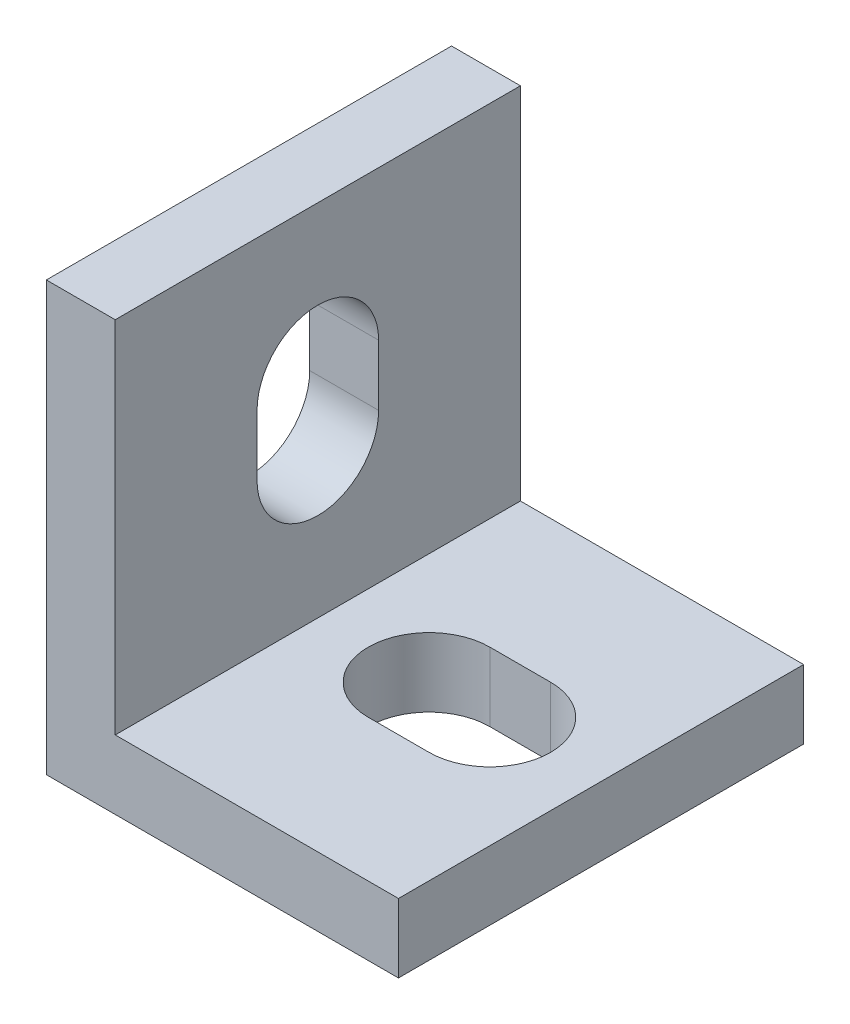
ISO-10303-21;
HEADER;
FILE_DESCRIPTION(('STEP AP214'),'2;1');
FILE_NAME('part.step','',(''),(''),'','','');
FILE_SCHEMA(('AUTOMOTIVE_DESIGN { 1 0 10303 214 1 1 1 1 }'));
ENDSEC;
DATA;
#1=APPLICATION_CONTEXT('core data for automotive mechanical design processes');
#2=APPLICATION_PROTOCOL_DEFINITION('international standard','automotive_design',2000,#1);
#3=PRODUCT_CONTEXT('',#1,'mechanical');
#4=PRODUCT('Part','Part','',(#3));
#5=PRODUCT_RELATED_PRODUCT_CATEGORY('part','',(#4));
#6=PRODUCT_DEFINITION_FORMATION('','',#4);
#7=PRODUCT_DEFINITION_CONTEXT('part definition',#1,'design');
#8=PRODUCT_DEFINITION('design','',#6,#7);
#9=PRODUCT_DEFINITION_SHAPE('','',#8);
#10=(LENGTH_UNIT() NAMED_UNIT(*) SI_UNIT(.MILLI.,.METRE.));
#11=(NAMED_UNIT(*) PLANE_ANGLE_UNIT() SI_UNIT($,.RADIAN.));
#12=(NAMED_UNIT(*) SI_UNIT($,.STERADIAN.) SOLID_ANGLE_UNIT());
#13=UNCERTAINTY_MEASURE_WITH_UNIT(LENGTH_MEASURE(1.E-05),#10,'distance_accuracy_value','');
#14=(GEOMETRIC_REPRESENTATION_CONTEXT(3) GLOBAL_UNCERTAINTY_ASSIGNED_CONTEXT((#13)) GLOBAL_UNIT_ASSIGNED_CONTEXT((#10,
#11,#12)) REPRESENTATION_CONTEXT('',''));
#15=CARTESIAN_POINT('',(0.,0.,0.));
#16=DIRECTION('',(0.,0.,1.));
#17=DIRECTION('',(1.,0.,0.));
#18=AXIS2_PLACEMENT_3D('',#15,#16,#17);
#19=CARTESIAN_POINT('',(0.,0.,20.));
#20=DIRECTION('',(1.,0.,0.));
#21=DIRECTION('',(0.,0.,-1.));
#22=AXIS2_PLACEMENT_3D('',#19,#20,#21);
#23=PLANE('',#22);
#24=DIRECTION('',(0.,1.,0.));
#25=VECTOR('',#24,1.);
#26=CARTESIAN_POINT('',(0.,0.,7.));
#27=LINE('',#26,#25);
#28=CARTESIAN_POINT('',(0.,10.775,7.));
#29=VERTEX_POINT('',#28);
#30=CARTESIAN_POINT('',(0.,13.775,7.));
#31=VERTEX_POINT('',#30);
#32=EDGE_CURVE('E231',#29,#31,#27,.T.);
#33=ORIENTED_EDGE('',*,*,#32,.T.);
#34=CARTESIAN_POINT('',(0.,13.775,10.));
#35=DIRECTION('',(1.,0.,0.));
#36=DIRECTION('',(0.,0.,-1.));
#37=AXIS2_PLACEMENT_3D('',#34,#35,#36);
#38=CIRCLE('',#37,3.);
#39=CARTESIAN_POINT('',(0.,13.775,13.));
#40=VERTEX_POINT('',#39);
#41=EDGE_CURVE('E235',#31,#40,#38,.T.);
#42=ORIENTED_EDGE('',*,*,#41,.T.);
#43=DIRECTION('',(0.,-1.,0.));
#44=VECTOR('',#43,1.);
#45=CARTESIAN_POINT('',(0.,0.,13.));
#46=LINE('',#45,#44);
#47=CARTESIAN_POINT('',(0.,10.775,13.));
#48=VERTEX_POINT('',#47);
#49=EDGE_CURVE('E214',#40,#48,#46,.T.);
#50=ORIENTED_EDGE('',*,*,#49,.T.);
#51=CARTESIAN_POINT('',(0.,10.775,10.));
#52=DIRECTION('',(1.,0.,0.));
#53=DIRECTION('',(0.,0.,-1.));
#54=AXIS2_PLACEMENT_3D('',#51,#52,#53);
#55=CIRCLE('',#54,3.);
#56=EDGE_CURVE('E227',#48,#29,#55,.T.);
#57=ORIENTED_EDGE('',*,*,#56,.T.);
#58=EDGE_LOOP('',(#33,#42,#50,#57));
#59=FACE_BOUND('',#58,.T.);
#60=DIRECTION('',(0.,-1.,0.));
#61=VECTOR('',#60,1.);
#62=CARTESIAN_POINT('',(0.,0.,0.));
#63=LINE('',#62,#61);
#64=CARTESIAN_POINT('',(0.,21.15,0.));
#65=VERTEX_POINT('',#64);
#66=CARTESIAN_POINT('',(0.,0.,0.));
#67=VERTEX_POINT('',#66);
#68=EDGE_CURVE('E239',#65,#67,#63,.T.);
#69=ORIENTED_EDGE('',*,*,#68,.T.);
#70=DIRECTION('',(0.,0.,-1.));
#71=VECTOR('',#70,1.);
#72=CARTESIAN_POINT('',(0.,0.,20.));
#73=LINE('',#72,#71);
#74=CARTESIAN_POINT('',(0.,0.,20.));
#75=VERTEX_POINT('',#74);
#76=EDGE_CURVE('E11',#75,#67,#73,.T.);
#77=ORIENTED_EDGE('',*,*,#76,.F.);
#78=DIRECTION('',(0.,-1.,0.));
#79=VECTOR('',#78,1.);
#80=CARTESIAN_POINT('',(0.,0.,20.));
#81=LINE('',#80,#79);
#82=CARTESIAN_POINT('',(0.,21.15,20.));
#83=VERTEX_POINT('',#82);
#84=EDGE_CURVE('E240',#83,#75,#81,.T.);
#85=ORIENTED_EDGE('',*,*,#84,.F.);
#86=DIRECTION('',(0.,0.,-1.));
#87=VECTOR('',#86,1.);
#88=CARTESIAN_POINT('',(0.,21.15,20.));
#89=LINE('',#88,#87);
#90=EDGE_CURVE('E259',#83,#65,#89,.T.);
#91=ORIENTED_EDGE('',*,*,#90,.T.);
#92=EDGE_LOOP('',(#69,#77,#85,#91));
#93=FACE_BOUND('',#92,.T.);
#94=ADVANCED_FACE('F43',(#59,#93),#23,.F.);
#95=CARTESIAN_POINT('',(0.,0.,20.));
#96=DIRECTION('',(0.,1.,0.));
#97=DIRECTION('',(0.,0.,1.));
#98=AXIS2_PLACEMENT_3D('',#95,#96,#97);
#99=PLANE('',#98);
#100=DIRECTION('',(-1.,0.,0.));
#101=VECTOR('',#100,1.);
#102=CARTESIAN_POINT('',(0.,0.,7.));
#103=LINE('',#102,#101);
#104=CARTESIAN_POINT('',(11.89,0.,7.));
#105=VERTEX_POINT('',#104);
#106=CARTESIAN_POINT('',(8.89,0.,7.));
#107=VERTEX_POINT('',#106);
#108=EDGE_CURVE('E187',#105,#107,#103,.T.);
#109=ORIENTED_EDGE('',*,*,#108,.T.);
#110=CARTESIAN_POINT('',(8.89,0.,10.));
#111=DIRECTION('',(0.,1.,0.));
#112=DIRECTION('',(0.,0.,1.));
#113=AXIS2_PLACEMENT_3D('',#110,#111,#112);
#114=CIRCLE('',#113,3.);
#115=CARTESIAN_POINT('',(8.89,0.,13.));
#116=VERTEX_POINT('',#115);
#117=EDGE_CURVE('E191',#107,#116,#114,.T.);
#118=ORIENTED_EDGE('',*,*,#117,.T.);
#119=DIRECTION('',(1.,0.,0.));
#120=VECTOR('',#119,1.);
#121=CARTESIAN_POINT('',(0.,0.,13.));
#122=LINE('',#121,#120);
#123=CARTESIAN_POINT('',(11.89,0.,13.));
#124=VERTEX_POINT('',#123);
#125=EDGE_CURVE('E178',#116,#124,#122,.T.);
#126=ORIENTED_EDGE('',*,*,#125,.T.);
#127=CARTESIAN_POINT('',(11.89,0.,10.));
#128=DIRECTION('',(0.,1.,0.));
#129=DIRECTION('',(0.,0.,1.));
#130=AXIS2_PLACEMENT_3D('',#127,#128,#129);
#131=CIRCLE('',#130,3.);
#132=EDGE_CURVE('E150',#124,#105,#131,.T.);
#133=ORIENTED_EDGE('',*,*,#132,.T.);
#134=EDGE_LOOP('',(#109,#118,#126,#133));
#135=FACE_BOUND('',#134,.T.);
#136=DIRECTION('',(1.,0.,0.));
#137=VECTOR('',#136,1.);
#138=CARTESIAN_POINT('',(0.,0.,0.));
#139=LINE('',#138,#137);
#140=CARTESIAN_POINT('',(17.38,0.,0.));
#141=VERTEX_POINT('',#140);
#142=EDGE_CURVE('E263',#67,#141,#139,.T.);
#143=ORIENTED_EDGE('',*,*,#142,.T.);
#144=DIRECTION('',(0.,0.,-1.));
#145=VECTOR('',#144,1.);
#146=CARTESIAN_POINT('',(17.38,0.,20.));
#147=LINE('',#146,#145);
#148=CARTESIAN_POINT('',(17.38,0.,20.));
#149=VERTEX_POINT('',#148);
#150=EDGE_CURVE('E51',#149,#141,#147,.T.);
#151=ORIENTED_EDGE('',*,*,#150,.F.);
#152=DIRECTION('',(1.,0.,0.));
#153=VECTOR('',#152,1.);
#154=CARTESIAN_POINT('',(0.,0.,20.));
#155=LINE('',#154,#153);
#156=EDGE_CURVE('E244',#75,#149,#155,.T.);
#157=ORIENTED_EDGE('',*,*,#156,.F.);
#158=ORIENTED_EDGE('',*,*,#76,.T.);
#159=EDGE_LOOP('',(#143,#151,#157,#158));
#160=FACE_BOUND('',#159,.T.);
#161=ADVANCED_FACE('F318',(#135,#160),#99,.F.);
#162=CARTESIAN_POINT('',(17.38,3.4,20.));
#163=DIRECTION('',(-1.,0.,0.));
#164=DIRECTION('',(0.,0.,1.));
#165=AXIS2_PLACEMENT_3D('',#162,#163,#164);
#166=PLANE('',#165);
#167=DIRECTION('',(0.,1.,0.));
#168=VECTOR('',#167,1.);
#169=CARTESIAN_POINT('',(17.38,3.4,0.));
#170=LINE('',#169,#168);
#171=CARTESIAN_POINT('',(17.38,3.4,0.));
#172=VERTEX_POINT('',#171);
#173=EDGE_CURVE('E266',#141,#172,#170,.T.);
#174=ORIENTED_EDGE('',*,*,#173,.T.);
#175=DIRECTION('',(0.,0.,-1.));
#176=VECTOR('',#175,1.);
#177=CARTESIAN_POINT('',(17.38,3.4,20.));
#178=LINE('',#177,#176);
#179=CARTESIAN_POINT('',(17.38,3.4,20.));
#180=VERTEX_POINT('',#179);
#181=EDGE_CURVE('E287',#180,#172,#178,.T.);
#182=ORIENTED_EDGE('',*,*,#181,.F.);
#183=DIRECTION('',(0.,1.,0.));
#184=VECTOR('',#183,1.);
#185=CARTESIAN_POINT('',(17.38,3.4,20.));
#186=LINE('',#185,#184);
#187=EDGE_CURVE('E247',#149,#180,#186,.T.);
#188=ORIENTED_EDGE('',*,*,#187,.F.);
#189=ORIENTED_EDGE('',*,*,#150,.T.);
#190=EDGE_LOOP('',(#174,#182,#188,#189));
#191=FACE_BOUND('',#190,.T.);
#192=ADVANCED_FACE('F297',(#191),#166,.F.);
#193=CARTESIAN_POINT('',(17.38,3.4,20.));
#194=DIRECTION('',(0.,-1.,0.));
#195=DIRECTION('',(0.,0.,-1.));
#196=AXIS2_PLACEMENT_3D('',#193,#194,#195);
#197=PLANE('',#196);
#198=DIRECTION('',(1.,0.,0.));
#199=VECTOR('',#198,1.);
#200=CARTESIAN_POINT('',(8.89,3.4,13.));
#201=LINE('',#200,#199);
#202=CARTESIAN_POINT('',(8.89,3.4,13.));
#203=VERTEX_POINT('',#202);
#204=CARTESIAN_POINT('',(11.89,3.4,13.));
#205=VERTEX_POINT('',#204);
#206=EDGE_CURVE('E157',#203,#205,#201,.T.);
#207=ORIENTED_EDGE('',*,*,#206,.F.);
#208=CARTESIAN_POINT('',(8.89,3.4,10.));
#209=DIRECTION('',(0.,1.,0.));
#210=DIRECTION('',(0.,0.,1.));
#211=AXIS2_PLACEMENT_3D('',#208,#209,#210);
#212=CIRCLE('',#211,3.);
#213=CARTESIAN_POINT('',(8.89,3.4,7.));
#214=VERTEX_POINT('',#213);
#215=EDGE_CURVE('E66',#214,#203,#212,.T.);
#216=ORIENTED_EDGE('',*,*,#215,.F.);
#217=DIRECTION('',(-1.,0.,0.));
#218=VECTOR('',#217,1.);
#219=CARTESIAN_POINT('',(8.89,3.4,7.));
#220=LINE('',#219,#218);
#221=CARTESIAN_POINT('',(11.89,3.4,7.));
#222=VERTEX_POINT('',#221);
#223=EDGE_CURVE('E165',#222,#214,#220,.T.);
#224=ORIENTED_EDGE('',*,*,#223,.F.);
#225=CARTESIAN_POINT('',(11.89,3.4,10.));
#226=DIRECTION('',(0.,1.,0.));
#227=DIRECTION('',(0.,0.,1.));
#228=AXIS2_PLACEMENT_3D('',#225,#226,#227);
#229=CIRCLE('',#228,3.);
#230=EDGE_CURVE('E147',#205,#222,#229,.T.);
#231=ORIENTED_EDGE('',*,*,#230,.F.);
#232=EDGE_LOOP('',(#207,#216,#224,#231));
#233=FACE_BOUND('',#232,.T.);
#234=DIRECTION('',(-1.,0.,0.));
#235=VECTOR('',#234,1.);
#236=CARTESIAN_POINT('',(17.38,3.4,0.));
#237=LINE('',#236,#235);
#238=CARTESIAN_POINT('',(3.4,3.4,0.));
#239=VERTEX_POINT('',#238);
#240=EDGE_CURVE('E269',#172,#239,#237,.T.);
#241=ORIENTED_EDGE('',*,*,#240,.T.);
#242=DIRECTION('',(0.,0.,-1.));
#243=VECTOR('',#242,1.);
#244=CARTESIAN_POINT('',(3.4,3.4,20.));
#245=LINE('',#244,#243);
#246=CARTESIAN_POINT('',(3.4,3.4,20.));
#247=VERTEX_POINT('',#246);
#248=EDGE_CURVE('E283',#247,#239,#245,.T.);
#249=ORIENTED_EDGE('',*,*,#248,.F.);
#250=DIRECTION('',(-1.,0.,0.));
#251=VECTOR('',#250,1.);
#252=CARTESIAN_POINT('',(17.38,3.4,20.));
#253=LINE('',#252,#251);
#254=EDGE_CURVE('E250',#180,#247,#253,.T.);
#255=ORIENTED_EDGE('',*,*,#254,.F.);
#256=ORIENTED_EDGE('',*,*,#181,.T.);
#257=EDGE_LOOP('',(#241,#249,#255,#256));
#258=FACE_BOUND('',#257,.T.);
#259=ADVANCED_FACE('F162',(#233,#258),#197,.F.);
#260=CARTESIAN_POINT('',(3.4,3.4,20.));
#261=DIRECTION('',(-1.,0.,0.));
#262=DIRECTION('',(0.,0.,1.));
#263=AXIS2_PLACEMENT_3D('',#260,#261,#262);
#264=PLANE('',#263);
#265=DIRECTION('',(0.,-1.,0.));
#266=VECTOR('',#265,1.);
#267=CARTESIAN_POINT('',(3.4,13.775,13.));
#268=LINE('',#267,#266);
#269=CARTESIAN_POINT('',(3.4,13.775,13.));
#270=VERTEX_POINT('',#269);
#271=CARTESIAN_POINT('',(3.4,10.775,13.));
#272=VERTEX_POINT('',#271);
#273=EDGE_CURVE('E198',#270,#272,#268,.T.);
#274=ORIENTED_EDGE('',*,*,#273,.F.);
#275=CARTESIAN_POINT('',(3.4,13.775,10.));
#276=DIRECTION('',(1.,0.,0.));
#277=DIRECTION('',(0.,0.,-1.));
#278=AXIS2_PLACEMENT_3D('',#275,#276,#277);
#279=CIRCLE('',#278,3.);
#280=CARTESIAN_POINT('',(3.4,13.775,7.));
#281=VERTEX_POINT('',#280);
#282=EDGE_CURVE('E195',#281,#270,#279,.T.);
#283=ORIENTED_EDGE('',*,*,#282,.F.);
#284=DIRECTION('',(0.,1.,0.));
#285=VECTOR('',#284,1.);
#286=CARTESIAN_POINT('',(3.4,13.775,7.));
#287=LINE('',#286,#285);
#288=CARTESIAN_POINT('',(3.4,10.775,7.));
#289=VERTEX_POINT('',#288);
#290=EDGE_CURVE('E206',#289,#281,#287,.T.);
#291=ORIENTED_EDGE('',*,*,#290,.F.);
#292=CARTESIAN_POINT('',(3.4,10.775,10.));
#293=DIRECTION('',(1.,0.,0.));
#294=DIRECTION('',(0.,0.,-1.));
#295=AXIS2_PLACEMENT_3D('',#292,#293,#294);
#296=CIRCLE('',#295,3.);
#297=EDGE_CURVE('E202',#272,#289,#296,.T.);
#298=ORIENTED_EDGE('',*,*,#297,.F.);
#299=EDGE_LOOP('',(#274,#283,#291,#298));
#300=FACE_BOUND('',#299,.T.);
#301=DIRECTION('',(0.,1.,0.));
#302=VECTOR('',#301,1.);
#303=CARTESIAN_POINT('',(3.4,3.4,0.));
#304=LINE('',#303,#302);
#305=CARTESIAN_POINT('',(3.4,21.15,0.));
#306=VERTEX_POINT('',#305);
#307=EDGE_CURVE('E271',#239,#306,#304,.T.);
#308=ORIENTED_EDGE('',*,*,#307,.T.);
#309=DIRECTION('',(0.,0.,-1.));
#310=VECTOR('',#309,1.);
#311=CARTESIAN_POINT('',(3.4,21.15,20.));
#312=LINE('',#311,#310);
#313=CARTESIAN_POINT('',(3.4,21.15,20.));
#314=VERTEX_POINT('',#313);
#315=EDGE_CURVE('E279',#314,#306,#312,.T.);
#316=ORIENTED_EDGE('',*,*,#315,.F.);
#317=DIRECTION('',(0.,1.,0.));
#318=VECTOR('',#317,1.);
#319=CARTESIAN_POINT('',(3.4,3.4,20.));
#320=LINE('',#319,#318);
#321=EDGE_CURVE('E253',#247,#314,#320,.T.);
#322=ORIENTED_EDGE('',*,*,#321,.F.);
#323=ORIENTED_EDGE('',*,*,#248,.T.);
#324=EDGE_LOOP('',(#308,#316,#322,#323));
#325=FACE_BOUND('',#324,.T.);
#326=ADVANCED_FACE('F310',(#300,#325),#264,.F.);
#327=CARTESIAN_POINT('',(0.,21.15,20.));
#328=DIRECTION('',(0.,-1.,0.));
#329=DIRECTION('',(0.,0.,-1.));
#330=AXIS2_PLACEMENT_3D('',#327,#328,#329);
#331=PLANE('',#330);
#332=DIRECTION('',(-1.,0.,0.));
#333=VECTOR('',#332,1.);
#334=CARTESIAN_POINT('',(0.,21.15,0.));
#335=LINE('',#334,#333);
#336=EDGE_CURVE('E245',#306,#65,#335,.T.);
#337=ORIENTED_EDGE('',*,*,#336,.T.);
#338=ORIENTED_EDGE('',*,*,#90,.F.);
#339=DIRECTION('',(-1.,0.,0.));
#340=VECTOR('',#339,1.);
#341=CARTESIAN_POINT('',(0.,21.15,20.));
#342=LINE('',#341,#340);
#343=EDGE_CURVE('E256',#314,#83,#342,.T.);
#344=ORIENTED_EDGE('',*,*,#343,.F.);
#345=ORIENTED_EDGE('',*,*,#315,.T.);
#346=EDGE_LOOP('',(#337,#338,#344,#345));
#347=FACE_BOUND('',#346,.T.);
#348=ADVANCED_FACE('F321',(#347),#331,.F.);
#349=CARTESIAN_POINT('',(0.,0.,20.));
#350=DIRECTION('',(0.,0.,-1.));
#351=DIRECTION('',(-1.,0.,0.));
#352=AXIS2_PLACEMENT_3D('',#349,#350,#351);
#353=PLANE('',#352);
#354=ORIENTED_EDGE('',*,*,#84,.T.);
#355=ORIENTED_EDGE('',*,*,#156,.T.);
#356=ORIENTED_EDGE('',*,*,#187,.T.);
#357=ORIENTED_EDGE('',*,*,#254,.T.);
#358=ORIENTED_EDGE('',*,*,#321,.T.);
#359=ORIENTED_EDGE('',*,*,#343,.T.);
#360=EDGE_LOOP('',(#354,#355,#356,#357,#358,#359));
#361=FACE_BOUND('',#360,.T.);
#362=ADVANCED_FACE('F314',(#361),#353,.F.);
#363=CARTESIAN_POINT('',(0.,0.,0.));
#364=DIRECTION('',(0.,0.,-1.));
#365=DIRECTION('',(-1.,0.,0.));
#366=AXIS2_PLACEMENT_3D('',#363,#364,#365);
#367=PLANE('',#366);
#368=ORIENTED_EDGE('',*,*,#68,.F.);
#369=ORIENTED_EDGE('',*,*,#336,.F.);
#370=ORIENTED_EDGE('',*,*,#307,.F.);
#371=ORIENTED_EDGE('',*,*,#240,.F.);
#372=ORIENTED_EDGE('',*,*,#173,.F.);
#373=ORIENTED_EDGE('',*,*,#142,.F.);
#374=EDGE_LOOP('',(#368,#369,#370,#371,#372,#373));
#375=FACE_BOUND('',#374,.T.);
#376=ADVANCED_FACE('F303',(#375),#367,.T.);
#377=CARTESIAN_POINT('',(-16.6,13.775,10.));
#378=DIRECTION('',(1.,0.,0.));
#379=DIRECTION('',(0.,0.,-1.));
#380=AXIS2_PLACEMENT_3D('',#377,#378,#379);
#381=CYLINDRICAL_SURFACE('',#380,3.);
#382=DIRECTION('',(1.,0.,0.));
#383=VECTOR('',#382,1.);
#384=CARTESIAN_POINT('',(-16.6,13.775,7.));
#385=LINE('',#384,#383);
#386=EDGE_CURVE('E211',#31,#281,#385,.T.);
#387=ORIENTED_EDGE('',*,*,#386,.T.);
#388=ORIENTED_EDGE('',*,*,#282,.T.);
#389=DIRECTION('',(1.,0.,0.));
#390=VECTOR('',#389,1.);
#391=CARTESIAN_POINT('',(-16.6,13.775,13.));
#392=LINE('',#391,#390);
#393=EDGE_CURVE('E210',#40,#270,#392,.T.);
#394=ORIENTED_EDGE('',*,*,#393,.F.);
#395=ORIENTED_EDGE('',*,*,#41,.F.);
#396=EDGE_LOOP('',(#387,#388,#394,#395));
#397=FACE_BOUND('',#396,.T.);
#398=ADVANCED_FACE('F352',(#397),#381,.F.);
#399=CARTESIAN_POINT('',(-16.6,13.775,7.));
#400=DIRECTION('',(0.,0.,-1.));
#401=DIRECTION('',(-1.,0.,0.));
#402=AXIS2_PLACEMENT_3D('',#399,#400,#401);
#403=PLANE('',#402);
#404=DIRECTION('',(1.,0.,0.));
#405=VECTOR('',#404,1.);
#406=CARTESIAN_POINT('',(-16.6,10.775,7.));
#407=LINE('',#406,#405);
#408=EDGE_CURVE('E215',#29,#289,#407,.T.);
#409=ORIENTED_EDGE('',*,*,#408,.T.);
#410=ORIENTED_EDGE('',*,*,#290,.T.);
#411=ORIENTED_EDGE('',*,*,#386,.F.);
#412=ORIENTED_EDGE('',*,*,#32,.F.);
#413=EDGE_LOOP('',(#409,#410,#411,#412));
#414=FACE_BOUND('',#413,.T.);
#415=ADVANCED_FACE('F343',(#414),#403,.F.);
#416=CARTESIAN_POINT('',(-16.6,10.775,10.));
#417=DIRECTION('',(1.,0.,0.));
#418=DIRECTION('',(0.,0.,-1.));
#419=AXIS2_PLACEMENT_3D('',#416,#417,#418);
#420=CYLINDRICAL_SURFACE('',#419,3.);
#421=DIRECTION('',(1.,0.,0.));
#422=VECTOR('',#421,1.);
#423=CARTESIAN_POINT('',(-16.6,10.775,13.));
#424=LINE('',#423,#422);
#425=EDGE_CURVE('E218',#48,#272,#424,.T.);
#426=ORIENTED_EDGE('',*,*,#425,.T.);
#427=ORIENTED_EDGE('',*,*,#297,.T.);
#428=ORIENTED_EDGE('',*,*,#408,.F.);
#429=ORIENTED_EDGE('',*,*,#56,.F.);
#430=EDGE_LOOP('',(#426,#427,#428,#429));
#431=FACE_BOUND('',#430,.T.);
#432=ADVANCED_FACE('F345',(#431),#420,.F.);
#433=CARTESIAN_POINT('',(-16.6,13.775,13.));
#434=DIRECTION('',(0.,0.,1.));
#435=DIRECTION('',(1.,0.,0.));
#436=AXIS2_PLACEMENT_3D('',#433,#434,#435);
#437=PLANE('',#436);
#438=ORIENTED_EDGE('',*,*,#393,.T.);
#439=ORIENTED_EDGE('',*,*,#273,.T.);
#440=ORIENTED_EDGE('',*,*,#425,.F.);
#441=ORIENTED_EDGE('',*,*,#49,.F.);
#442=EDGE_LOOP('',(#438,#439,#440,#441));
#443=FACE_BOUND('',#442,.T.);
#444=ADVANCED_FACE('F354',(#443),#437,.F.);
#445=CARTESIAN_POINT('',(8.89,-16.6,10.));
#446=DIRECTION('',(0.,1.,0.));
#447=DIRECTION('',(0.,0.,1.));
#448=AXIS2_PLACEMENT_3D('',#445,#446,#447);
#449=CYLINDRICAL_SURFACE('',#448,3.);
#450=DIRECTION('',(0.,1.,0.));
#451=VECTOR('',#450,1.);
#452=CARTESIAN_POINT('',(8.89,-16.6,7.));
#453=LINE('',#452,#451);
#454=EDGE_CURVE('E175',#107,#214,#453,.T.);
#455=ORIENTED_EDGE('',*,*,#454,.T.);
#456=ORIENTED_EDGE('',*,*,#215,.T.);
#457=DIRECTION('',(0.,1.,0.));
#458=VECTOR('',#457,1.);
#459=CARTESIAN_POINT('',(8.89,-16.6,13.));
#460=LINE('',#459,#458);
#461=EDGE_CURVE('E154',#116,#203,#460,.T.);
#462=ORIENTED_EDGE('',*,*,#461,.F.);
#463=ORIENTED_EDGE('',*,*,#117,.F.);
#464=EDGE_LOOP('',(#455,#456,#462,#463));
#465=FACE_BOUND('',#464,.T.);
#466=ADVANCED_FACE('F356',(#465),#449,.F.);
#467=CARTESIAN_POINT('',(8.89,-16.6,7.));
#468=DIRECTION('',(0.,0.,-1.));
#469=DIRECTION('',(-1.,0.,0.));
#470=AXIS2_PLACEMENT_3D('',#467,#468,#469);
#471=PLANE('',#470);
#472=DIRECTION('',(0.,1.,0.));
#473=VECTOR('',#472,1.);
#474=CARTESIAN_POINT('',(11.89,-16.6,7.));
#475=LINE('',#474,#473);
#476=EDGE_CURVE('E153',#105,#222,#475,.T.);
#477=ORIENTED_EDGE('',*,*,#476,.T.);
#478=ORIENTED_EDGE('',*,*,#223,.T.);
#479=ORIENTED_EDGE('',*,*,#454,.F.);
#480=ORIENTED_EDGE('',*,*,#108,.F.);
#481=EDGE_LOOP('',(#477,#478,#479,#480));
#482=FACE_BOUND('',#481,.T.);
#483=ADVANCED_FACE('F363',(#482),#471,.F.);
#484=CARTESIAN_POINT('',(11.89,-16.6,10.));
#485=DIRECTION('',(0.,1.,0.));
#486=DIRECTION('',(0.,0.,1.));
#487=AXIS2_PLACEMENT_3D('',#484,#485,#486);
#488=CYLINDRICAL_SURFACE('',#487,3.);
#489=DIRECTION('',(0.,1.,0.));
#490=VECTOR('',#489,1.);
#491=CARTESIAN_POINT('',(11.89,-16.6,13.));
#492=LINE('',#491,#490);
#493=EDGE_CURVE('E58',#124,#205,#492,.T.);
#494=ORIENTED_EDGE('',*,*,#493,.T.);
#495=ORIENTED_EDGE('',*,*,#230,.T.);
#496=ORIENTED_EDGE('',*,*,#476,.F.);
#497=ORIENTED_EDGE('',*,*,#132,.F.);
#498=EDGE_LOOP('',(#494,#495,#496,#497));
#499=FACE_BOUND('',#498,.T.);
#500=ADVANCED_FACE('F144',(#499),#488,.F.);
#501=CARTESIAN_POINT('',(8.89,-16.6,13.));
#502=DIRECTION('',(0.,0.,1.));
#503=DIRECTION('',(1.,0.,0.));
#504=AXIS2_PLACEMENT_3D('',#501,#502,#503);
#505=PLANE('',#504);
#506=ORIENTED_EDGE('',*,*,#461,.T.);
#507=ORIENTED_EDGE('',*,*,#206,.T.);
#508=ORIENTED_EDGE('',*,*,#493,.F.);
#509=ORIENTED_EDGE('',*,*,#125,.F.);
#510=EDGE_LOOP('',(#506,#507,#508,#509));
#511=FACE_BOUND('',#510,.T.);
#512=ADVANCED_FACE('F158',(#511),#505,.F.);
#513=CLOSED_SHELL('',(#94,#161,#192,#259,#326,#348,#362,#376,#398,#415,#432,#444,#466,#483,#500,#512));
#514=MANIFOLD_SOLID_BREP('B2',#513);
#515=ADVANCED_BREP_SHAPE_REPRESENTATION('',(#18,#514),#14);
#516=SHAPE_DEFINITION_REPRESENTATION(#9,#515);
ENDSEC;
END-ISO-10303-21;
